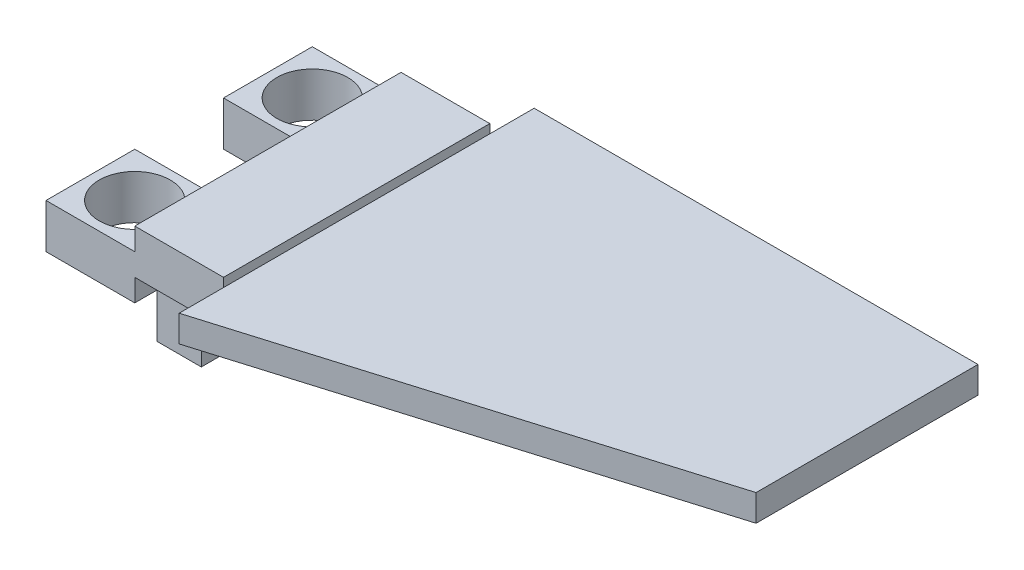
ISO-10303-21;
HEADER;
FILE_DESCRIPTION(('STEP AP214'),'2;1');
FILE_NAME('part.step','',(''),(''),'','','');
FILE_SCHEMA(('AUTOMOTIVE_DESIGN { 1 0 10303 214 1 1 1 1 }'));
ENDSEC;
DATA;
#1=APPLICATION_CONTEXT('core data for automotive mechanical design processes');
#2=APPLICATION_PROTOCOL_DEFINITION('international standard','automotive_design',2000,#1);
#3=PRODUCT_CONTEXT('',#1,'mechanical');
#4=PRODUCT('Part','Part','',(#3));
#5=PRODUCT_RELATED_PRODUCT_CATEGORY('part','',(#4));
#6=PRODUCT_DEFINITION_FORMATION('','',#4);
#7=PRODUCT_DEFINITION_CONTEXT('part definition',#1,'design');
#8=PRODUCT_DEFINITION('design','',#6,#7);
#9=PRODUCT_DEFINITION_SHAPE('','',#8);
#10=(LENGTH_UNIT() NAMED_UNIT(*) SI_UNIT(.MILLI.,.METRE.));
#11=(NAMED_UNIT(*) PLANE_ANGLE_UNIT() SI_UNIT($,.RADIAN.));
#12=(NAMED_UNIT(*) SI_UNIT($,.STERADIAN.) SOLID_ANGLE_UNIT());
#13=UNCERTAINTY_MEASURE_WITH_UNIT(LENGTH_MEASURE(1.E-05),#10,'distance_accuracy_value','');
#14=(GEOMETRIC_REPRESENTATION_CONTEXT(3) GLOBAL_UNCERTAINTY_ASSIGNED_CONTEXT((#13)) GLOBAL_UNIT_ASSIGNED_CONTEXT((#10,
#11,#12)) REPRESENTATION_CONTEXT('',''));
#15=CARTESIAN_POINT('',(0.,0.,0.));
#16=DIRECTION('',(0.,0.,1.));
#17=DIRECTION('',(1.,0.,0.));
#18=AXIS2_PLACEMENT_3D('',#15,#16,#17);
#19=CARTESIAN_POINT('',(9.99999999999999,5.,-15.));
#20=DIRECTION('',(-1.,0.,0.));
#21=DIRECTION('',(0.,0.,1.));
#22=AXIS2_PLACEMENT_3D('',#19,#20,#21);
#23=PLANE('',#22);
#24=DIRECTION('',(0.,0.,1.));
#25=VECTOR('',#24,1.);
#26=CARTESIAN_POINT('',(10.,2.5,-25.));
#27=LINE('',#26,#25);
#28=CARTESIAN_POINT('',(10.,2.5,-25.));
#29=VERTEX_POINT('',#28);
#30=CARTESIAN_POINT('',(9.99999999999999,2.5,-22.5));
#31=VERTEX_POINT('',#30);
#32=EDGE_CURVE('E263',#29,#31,#27,.T.);
#33=ORIENTED_EDGE('',*,*,#32,.T.);
#34=DIRECTION('',(0.,1.,0.));
#35=VECTOR('',#34,1.);
#36=CARTESIAN_POINT('',(9.99999999999999,-5.,-22.5));
#37=LINE('',#36,#35);
#38=CARTESIAN_POINT('',(9.99999999999999,0.,-22.5));
#39=VERTEX_POINT('',#38);
#40=EDGE_CURVE('E351',#39,#31,#37,.T.);
#41=ORIENTED_EDGE('',*,*,#40,.F.);
#42=DIRECTION('',(0.,0.,-1.));
#43=VECTOR('',#42,1.);
#44=CARTESIAN_POINT('',(9.99999999999999,0.,-15.));
#45=LINE('',#44,#43);
#46=CARTESIAN_POINT('',(10.,0.,-25.));
#47=VERTEX_POINT('',#46);
#48=EDGE_CURVE('E440',#39,#47,#45,.T.);
#49=ORIENTED_EDGE('',*,*,#48,.T.);
#50=DIRECTION('',(0.,-1.,0.));
#51=VECTOR('',#50,1.);
#52=CARTESIAN_POINT('',(10.,5.,-25.));
#53=LINE('',#52,#51);
#54=EDGE_CURVE('E58',#29,#47,#53,.T.);
#55=ORIENTED_EDGE('',*,*,#54,.F.);
#56=EDGE_LOOP('',(#33,#41,#49,#55));
#57=FACE_BOUND('',#56,.T.);
#58=ADVANCED_FACE('F35',(#57),#23,.F.);
#59=CARTESIAN_POINT('',(9.99999999999999,2.5,-17.5));
#60=VERTEX_POINT('',#59);
#61=CARTESIAN_POINT('',(9.99999999999999,2.5,-15.));
#62=VERTEX_POINT('',#61);
#63=EDGE_CURVE('E266',#60,#62,#27,.T.);
#64=ORIENTED_EDGE('',*,*,#63,.T.);
#65=DIRECTION('',(0.,-1.,0.));
#66=VECTOR('',#65,1.);
#67=CARTESIAN_POINT('',(9.99999999999999,5.,-15.));
#68=LINE('',#67,#66);
#69=CARTESIAN_POINT('',(9.99999999999999,0.,-15.));
#70=VERTEX_POINT('',#69);
#71=EDGE_CURVE('E448',#62,#70,#68,.T.);
#72=ORIENTED_EDGE('',*,*,#71,.T.);
#73=CARTESIAN_POINT('',(9.99999999999999,0.,-17.5));
#74=VERTEX_POINT('',#73);
#75=EDGE_CURVE('E441',#70,#74,#45,.T.);
#76=ORIENTED_EDGE('',*,*,#75,.T.);
#77=DIRECTION('',(0.,-1.,0.));
#78=VECTOR('',#77,1.);
#79=CARTESIAN_POINT('',(9.99999999999999,-5.,-17.5));
#80=LINE('',#79,#78);
#81=EDGE_CURVE('E365',#60,#74,#80,.T.);
#82=ORIENTED_EDGE('',*,*,#81,.F.);
#83=EDGE_LOOP('',(#64,#72,#76,#82));
#84=FACE_BOUND('',#83,.T.);
#85=ADVANCED_FACE('F591',(#84),#23,.F.);
#86=CARTESIAN_POINT('',(0.,3.5,0.));
#87=DIRECTION('',(0.,-1.,0.));
#88=DIRECTION('',(0.,0.,-1.));
#89=AXIS2_PLACEMENT_3D('',#86,#87,#88);
#90=PLANE('',#89);
#91=DIRECTION('',(0.,0.,-1.));
#92=VECTOR('',#91,1.);
#93=CARTESIAN_POINT('',(19.9999999997544,3.5,291573.5));
#94=LINE('',#93,#92);
#95=CARTESIAN_POINT('',(19.9999999999567,3.5,9.99999999993406));
#96=VERTEX_POINT('',#95);
#97=CARTESIAN_POINT('',(19.9999999999818,3.5,4.99999999999545));
#98=VERTEX_POINT('',#97);
#99=EDGE_CURVE('E400',#96,#98,#94,.T.);
#100=ORIENTED_EDGE('',*,*,#99,.T.);
#101=DIRECTION('',(0.,0.,-1.));
#102=VECTOR('',#101,1.);
#103=CARTESIAN_POINT('',(20.,3.5,0.));
#104=LINE('',#103,#102);
#105=CARTESIAN_POINT('',(19.9999999999818,3.5,-24.9999999999773));
#106=VERTEX_POINT('',#105);
#107=EDGE_CURVE('E349',#98,#106,#104,.T.);
#108=ORIENTED_EDGE('',*,*,#107,.T.);
#109=DIRECTION('',(0.,0.,-1.));
#110=VECTOR('',#109,1.);
#111=CARTESIAN_POINT('',(19.9999999999818,3.5,291573.5));
#112=LINE('',#111,#110);
#113=CARTESIAN_POINT('',(19.9999999999818,3.5,-29.9999999999727));
#114=VERTEX_POINT('',#113);
#115=EDGE_CURVE('E379',#106,#114,#112,.T.);
#116=ORIENTED_EDGE('',*,*,#115,.T.);
#117=DIRECTION('',(1.,0.,0.));
#118=VECTOR('',#117,1.);
#119=CARTESIAN_POINT('',(-399985.,3.5,-29.9999999999727));
#120=LINE('',#119,#118);
#121=CARTESIAN_POINT('',(69.9999999999932,3.5,-29.9999999999727));
#122=VERTEX_POINT('',#121);
#123=EDGE_CURVE('E374',#114,#122,#120,.T.);
#124=ORIENTED_EDGE('',*,*,#123,.T.);
#125=DIRECTION('',(0.,0.,1.));
#126=VECTOR('',#125,1.);
#127=CARTESIAN_POINT('',(69.9999999999932,3.5,291573.5));
#128=LINE('',#127,#126);
#129=CARTESIAN_POINT('',(69.9999999999932,3.5,-5.0000000000523));
#130=VERTEX_POINT('',#129);
#131=EDGE_CURVE('E394',#122,#130,#128,.T.);
#132=ORIENTED_EDGE('',*,*,#131,.T.);
#133=DIRECTION('',(-0.957826285221151,0.,0.287347885566345));
#134=VECTOR('',#133,1.);
#135=CARTESIAN_POINT('',(-447203.899082569,3.5,134177.169724771));
#136=LINE('',#135,#134);
#137=EDGE_CURVE('E397',#130,#96,#136,.T.);
#138=ORIENTED_EDGE('',*,*,#137,.T.);
#139=EDGE_LOOP('',(#100,#108,#116,#124,#132,#138));
#140=FACE_BOUND('',#139,.T.);
#141=ADVANCED_FACE('F516',(#140),#90,.T.);
#142=CARTESIAN_POINT('',(0.,6.5,0.));
#143=DIRECTION('',(0.,-1.,0.));
#144=DIRECTION('',(0.,0.,-1.));
#145=AXIS2_PLACEMENT_3D('',#142,#143,#144);
#146=PLANE('',#145);
#147=DIRECTION('',(0.,0.,-1.));
#148=VECTOR('',#147,1.);
#149=CARTESIAN_POINT('',(20.,6.5,0.));
#150=LINE('',#149,#148);
#151=CARTESIAN_POINT('',(20.,6.5,5.));
#152=VERTEX_POINT('',#151);
#153=CARTESIAN_POINT('',(19.9999999999818,6.5,-24.9999999999773));
#154=VERTEX_POINT('',#153);
#155=EDGE_CURVE('E11',#152,#154,#150,.T.);
#156=ORIENTED_EDGE('',*,*,#155,.F.);
#157=DIRECTION('',(0.,0.,-1.));
#158=VECTOR('',#157,1.);
#159=CARTESIAN_POINT('',(19.9999999997544,6.5,291573.5));
#160=LINE('',#159,#158);
#161=CARTESIAN_POINT('',(19.9999999999567,6.5,9.99999999993406));
#162=VERTEX_POINT('',#161);
#163=EDGE_CURVE('E385',#162,#152,#160,.T.);
#164=ORIENTED_EDGE('',*,*,#163,.F.);
#165=DIRECTION('',(-0.957826285221151,0.,0.287347885566345));
#166=VECTOR('',#165,1.);
#167=CARTESIAN_POINT('',(-447203.899082569,6.5,134177.169724771));
#168=LINE('',#167,#166);
#169=CARTESIAN_POINT('',(69.9999999999932,6.5,-5.0000000000523));
#170=VERTEX_POINT('',#169);
#171=EDGE_CURVE('E382',#170,#162,#168,.T.);
#172=ORIENTED_EDGE('',*,*,#171,.F.);
#173=DIRECTION('',(0.,0.,1.));
#174=VECTOR('',#173,1.);
#175=CARTESIAN_POINT('',(69.9999999999932,6.5,291573.5));
#176=LINE('',#175,#174);
#177=CARTESIAN_POINT('',(69.9999999999932,6.5,-29.9999999999727));
#178=VERTEX_POINT('',#177);
#179=EDGE_CURVE('E378',#178,#170,#176,.T.);
#180=ORIENTED_EDGE('',*,*,#179,.F.);
#181=DIRECTION('',(1.,0.,0.));
#182=VECTOR('',#181,1.);
#183=CARTESIAN_POINT('',(-399985.,6.5,-29.9999999999727));
#184=LINE('',#183,#182);
#185=CARTESIAN_POINT('',(19.9999999999818,6.5,-29.9999999999727));
#186=VERTEX_POINT('',#185);
#187=EDGE_CURVE('E375',#186,#178,#184,.T.);
#188=ORIENTED_EDGE('',*,*,#187,.F.);
#189=DIRECTION('',(0.,0.,-1.));
#190=VECTOR('',#189,1.);
#191=CARTESIAN_POINT('',(19.9999999999818,6.5,291573.5));
#192=LINE('',#191,#190);
#193=EDGE_CURVE('E388',#154,#186,#192,.T.);
#194=ORIENTED_EDGE('',*,*,#193,.F.);
#195=EDGE_LOOP('',(#156,#164,#172,#180,#188,#194));
#196=FACE_BOUND('',#195,.T.);
#197=ADVANCED_FACE('F508',(#196),#146,.F.);
#198=CARTESIAN_POINT('',(15.,-5.,-22.5));
#199=DIRECTION('',(0.,0.,1.));
#200=DIRECTION('',(1.,0.,0.));
#201=AXIS2_PLACEMENT_3D('',#198,#199,#200);
#202=PLANE('',#201);
#203=DIRECTION('',(-1.,0.,0.));
#204=VECTOR('',#203,1.);
#205=CARTESIAN_POINT('',(15.,2.5,-22.5));
#206=LINE('',#205,#204);
#207=CARTESIAN_POINT('',(15.,2.5,-22.5));
#208=VERTEX_POINT('',#207);
#209=EDGE_CURVE('E346',#208,#31,#206,.T.);
#210=ORIENTED_EDGE('',*,*,#209,.F.);
#211=DIRECTION('',(0.,1.,0.));
#212=VECTOR('',#211,1.);
#213=CARTESIAN_POINT('',(15.,-5.,-22.5));
#214=LINE('',#213,#212);
#215=CARTESIAN_POINT('',(15.,-5.,-22.5));
#216=VERTEX_POINT('',#215);
#217=EDGE_CURVE('E352',#216,#208,#214,.T.);
#218=ORIENTED_EDGE('',*,*,#217,.F.);
#219=DIRECTION('',(-1.,0.,0.));
#220=VECTOR('',#219,1.);
#221=CARTESIAN_POINT('',(15.,-5.,-22.5));
#222=LINE('',#221,#220);
#223=CARTESIAN_POINT('',(9.99999999999999,-5.,-22.5));
#224=VERTEX_POINT('',#223);
#225=EDGE_CURVE('E359',#216,#224,#222,.T.);
#226=ORIENTED_EDGE('',*,*,#225,.T.);
#227=EDGE_CURVE('E360',#224,#39,#37,.T.);
#228=ORIENTED_EDGE('',*,*,#227,.T.);
#229=ORIENTED_EDGE('',*,*,#40,.T.);
#230=EDGE_LOOP('',(#210,#218,#226,#228,#229));
#231=FACE_BOUND('',#230,.T.);
#232=ADVANCED_FACE('F474',(#231),#202,.F.);
#233=CARTESIAN_POINT('',(15.,-5.,-17.5));
#234=DIRECTION('',(0.,0.,-1.));
#235=DIRECTION('',(-1.,0.,0.));
#236=AXIS2_PLACEMENT_3D('',#233,#234,#235);
#237=PLANE('',#236);
#238=DIRECTION('',(1.,0.,0.));
#239=VECTOR('',#238,1.);
#240=CARTESIAN_POINT('',(15.,2.5,-17.5));
#241=LINE('',#240,#239);
#242=CARTESIAN_POINT('',(15.,2.5,-17.5));
#243=VERTEX_POINT('',#242);
#244=EDGE_CURVE('E343',#60,#243,#241,.T.);
#245=ORIENTED_EDGE('',*,*,#244,.F.);
#246=ORIENTED_EDGE('',*,*,#81,.T.);
#247=CARTESIAN_POINT('',(9.99999999999999,-5.,-17.5));
#248=VERTEX_POINT('',#247);
#249=EDGE_CURVE('E363',#74,#248,#80,.T.);
#250=ORIENTED_EDGE('',*,*,#249,.T.);
#251=DIRECTION('',(-1.,0.,0.));
#252=VECTOR('',#251,1.);
#253=CARTESIAN_POINT('',(15.,-5.,-17.5));
#254=LINE('',#253,#252);
#255=CARTESIAN_POINT('',(15.,-5.,-17.5));
#256=VERTEX_POINT('',#255);
#257=EDGE_CURVE('E369',#256,#248,#254,.T.);
#258=ORIENTED_EDGE('',*,*,#257,.F.);
#259=DIRECTION('',(0.,-1.,0.));
#260=VECTOR('',#259,1.);
#261=CARTESIAN_POINT('',(15.,-5.,-17.5));
#262=LINE('',#261,#260);
#263=EDGE_CURVE('E354',#243,#256,#262,.T.);
#264=ORIENTED_EDGE('',*,*,#263,.F.);
#265=EDGE_LOOP('',(#245,#246,#250,#258,#264));
#266=FACE_BOUND('',#265,.T.);
#267=ADVANCED_FACE('F464',(#266),#237,.F.);
#268=CARTESIAN_POINT('',(15.,0.,0.));
#269=DIRECTION('',(-1.,0.,0.));
#270=DIRECTION('',(0.,0.,1.));
#271=AXIS2_PLACEMENT_3D('',#268,#269,#270);
#272=PLANE('',#271);
#273=DIRECTION('',(0.,0.,-1.));
#274=VECTOR('',#273,1.);
#275=CARTESIAN_POINT('',(15.,2.5,0.));
#276=LINE('',#275,#274);
#277=EDGE_CURVE('E43',#243,#208,#276,.T.);
#278=ORIENTED_EDGE('',*,*,#277,.F.);
#279=ORIENTED_EDGE('',*,*,#263,.T.);
#280=DIRECTION('',(0.,0.,-1.));
#281=VECTOR('',#280,1.);
#282=CARTESIAN_POINT('',(15.,-5.,-17.5));
#283=LINE('',#282,#281);
#284=EDGE_CURVE('E357',#256,#216,#283,.T.);
#285=ORIENTED_EDGE('',*,*,#284,.T.);
#286=ORIENTED_EDGE('',*,*,#217,.T.);
#287=EDGE_LOOP('',(#278,#279,#285,#286));
#288=FACE_BOUND('',#287,.T.);
#289=ADVANCED_FACE('F460',(#288),#272,.F.);
#290=CARTESIAN_POINT('',(0.,5.,0.));
#291=DIRECTION('',(0.,-1.,0.));
#292=DIRECTION('',(0.,0.,-1.));
#293=AXIS2_PLACEMENT_3D('',#290,#291,#292);
#294=PLANE('',#293);
#295=DIRECTION('',(0.,0.,1.));
#296=VECTOR('',#295,1.);
#297=CARTESIAN_POINT('',(0.,5.,-15.));
#298=LINE('',#297,#296);
#299=CARTESIAN_POINT('',(0.,5.,-25.));
#300=VERTEX_POINT('',#299);
#301=CARTESIAN_POINT('',(0.,5.,-15.));
#302=VERTEX_POINT('',#301);
#303=EDGE_CURVE('E424',#300,#302,#298,.T.);
#304=ORIENTED_EDGE('',*,*,#303,.T.);
#305=DIRECTION('',(1.,0.,0.));
#306=VECTOR('',#305,1.);
#307=CARTESIAN_POINT('',(0.,5.,-15.));
#308=LINE('',#307,#306);
#309=CARTESIAN_POINT('',(9.99999999999999,5.,-15.));
#310=VERTEX_POINT('',#309);
#311=EDGE_CURVE('E427',#302,#310,#308,.T.);
#312=ORIENTED_EDGE('',*,*,#311,.T.);
#313=DIRECTION('',(0.,0.,-1.));
#314=VECTOR('',#313,1.);
#315=CARTESIAN_POINT('',(9.99999999999999,5.,-15.));
#316=LINE('',#315,#314);
#317=CARTESIAN_POINT('',(10.,5.,-25.));
#318=VERTEX_POINT('',#317);
#319=EDGE_CURVE('E430',#310,#318,#316,.T.);
#320=ORIENTED_EDGE('',*,*,#319,.T.);
#321=DIRECTION('',(-1.,0.,0.));
#322=VECTOR('',#321,1.);
#323=CARTESIAN_POINT('',(0.,5.,-25.));
#324=LINE('',#323,#322);
#325=EDGE_CURVE('E432',#318,#300,#324,.T.);
#326=ORIENTED_EDGE('',*,*,#325,.T.);
#327=EDGE_LOOP('',(#304,#312,#320,#326));
#328=FACE_BOUND('',#327,.T.);
#329=CARTESIAN_POINT('',(5.,5.,-20.));
#330=DIRECTION('',(0.,1.,0.));
#331=DIRECTION('',(0.,0.,-1.));
#332=AXIS2_PLACEMENT_3D('',#329,#330,#331);
#333=CIRCLE('',#332,4.);
#334=CARTESIAN_POINT('',(5.,5.,-24.));
#335=VERTEX_POINT('',#334);
#336=EDGE_CURVE('E418',#335,#335,#333,.T.);
#337=ORIENTED_EDGE('',*,*,#336,.F.);
#338=EDGE_LOOP('',(#337));
#339=FACE_BOUND('',#338,.T.);
#340=ADVANCED_FACE('F493',(#328,#339),#294,.F.);
#341=CARTESIAN_POINT('',(0.,0.,0.));
#342=DIRECTION('',(0.,-1.,0.));
#343=DIRECTION('',(0.,0.,-1.));
#344=AXIS2_PLACEMENT_3D('',#341,#342,#343);
#345=PLANE('',#344);
#346=DIRECTION('',(0.,0.,1.));
#347=VECTOR('',#346,1.);
#348=CARTESIAN_POINT('',(0.,0.,-15.));
#349=LINE('',#348,#347);
#350=CARTESIAN_POINT('',(0.,0.,-25.));
#351=VERTEX_POINT('',#350);
#352=CARTESIAN_POINT('',(0.,0.,-15.));
#353=VERTEX_POINT('',#352);
#354=EDGE_CURVE('E421',#351,#353,#349,.T.);
#355=ORIENTED_EDGE('',*,*,#354,.F.);
#356=DIRECTION('',(-1.,0.,0.));
#357=VECTOR('',#356,1.);
#358=CARTESIAN_POINT('',(0.,0.,-25.));
#359=LINE('',#358,#357);
#360=EDGE_CURVE('E428',#47,#351,#359,.T.);
#361=ORIENTED_EDGE('',*,*,#360,.F.);
#362=ORIENTED_EDGE('',*,*,#48,.F.);
#363=DIRECTION('',(0.,0.,-1.));
#364=VECTOR('',#363,1.);
#365=CARTESIAN_POINT('',(10.,0.,0.));
#366=LINE('',#365,#364);
#367=EDGE_CURVE('E372',#74,#39,#366,.T.);
#368=ORIENTED_EDGE('',*,*,#367,.F.);
#369=ORIENTED_EDGE('',*,*,#75,.F.);
#370=DIRECTION('',(1.,0.,0.));
#371=VECTOR('',#370,1.);
#372=CARTESIAN_POINT('',(0.,0.,-15.));
#373=LINE('',#372,#371);
#374=EDGE_CURVE('E437',#353,#70,#373,.T.);
#375=ORIENTED_EDGE('',*,*,#374,.F.);
#376=EDGE_LOOP('',(#355,#361,#362,#368,#369,#375));
#377=FACE_BOUND('',#376,.T.);
#378=CARTESIAN_POINT('',(5.,0.,-20.));
#379=DIRECTION('',(0.,1.,0.));
#380=DIRECTION('',(0.,0.,-1.));
#381=AXIS2_PLACEMENT_3D('',#378,#379,#380);
#382=CIRCLE('',#381,4.);
#383=CARTESIAN_POINT('',(5.,0.,-24.));
#384=VERTEX_POINT('',#383);
#385=EDGE_CURVE('E407',#384,#384,#382,.T.);
#386=ORIENTED_EDGE('',*,*,#385,.T.);
#387=EDGE_LOOP('',(#386));
#388=FACE_BOUND('',#387,.T.);
#389=ADVANCED_FACE('F482',(#377,#388),#345,.T.);
#390=CARTESIAN_POINT('',(0.,5.,-15.));
#391=DIRECTION('',(1.,0.,0.));
#392=DIRECTION('',(0.,0.,-1.));
#393=AXIS2_PLACEMENT_3D('',#390,#391,#392);
#394=PLANE('',#393);
#395=ORIENTED_EDGE('',*,*,#354,.T.);
#396=DIRECTION('',(0.,-1.,0.));
#397=VECTOR('',#396,1.);
#398=CARTESIAN_POINT('',(0.,5.,-15.));
#399=LINE('',#398,#397);
#400=EDGE_CURVE('E450',#302,#353,#399,.T.);
#401=ORIENTED_EDGE('',*,*,#400,.F.);
#402=ORIENTED_EDGE('',*,*,#303,.F.);
#403=DIRECTION('',(0.,-1.,0.));
#404=VECTOR('',#403,1.);
#405=CARTESIAN_POINT('',(0.,5.,-25.));
#406=LINE('',#405,#404);
#407=EDGE_CURVE('E434',#300,#351,#406,.T.);
#408=ORIENTED_EDGE('',*,*,#407,.T.);
#409=EDGE_LOOP('',(#395,#401,#402,#408));
#410=FACE_BOUND('',#409,.T.);
#411=ADVANCED_FACE('F37',(#410),#394,.F.);
#412=CARTESIAN_POINT('',(0.,5.,-15.));
#413=DIRECTION('',(0.,0.,-1.));
#414=DIRECTION('',(-1.,0.,0.));
#415=AXIS2_PLACEMENT_3D('',#412,#413,#414);
#416=PLANE('',#415);
#417=ORIENTED_EDGE('',*,*,#374,.T.);
#418=ORIENTED_EDGE('',*,*,#71,.F.);
#419=EDGE_CURVE('E50',#310,#62,#68,.T.);
#420=ORIENTED_EDGE('',*,*,#419,.F.);
#421=ORIENTED_EDGE('',*,*,#311,.F.);
#422=ORIENTED_EDGE('',*,*,#400,.T.);
#423=EDGE_LOOP('',(#417,#418,#420,#421,#422));
#424=FACE_BOUND('',#423,.T.);
#425=ADVANCED_FACE('F598',(#424),#416,.F.);
#426=CARTESIAN_POINT('',(0.,5.,-25.));
#427=DIRECTION('',(0.,0.,1.));
#428=DIRECTION('',(1.,0.,0.));
#429=AXIS2_PLACEMENT_3D('',#426,#427,#428);
#430=PLANE('',#429);
#431=DIRECTION('',(0.,-1.,0.));
#432=VECTOR('',#431,1.);
#433=CARTESIAN_POINT('',(19.9999999999818,6.5,-24.9999999999773));
#434=LINE('',#433,#432);
#435=EDGE_CURVE('E408',#154,#106,#434,.T.);
#436=ORIENTED_EDGE('',*,*,#435,.T.);
#437=DIRECTION('',(0.,-1.,0.));
#438=VECTOR('',#437,1.);
#439=CARTESIAN_POINT('',(20.,7.5,-25.));
#440=LINE('',#439,#438);
#441=CARTESIAN_POINT('',(20.,2.5,-25.));
#442=VERTEX_POINT('',#441);
#443=EDGE_CURVE('E262',#106,#442,#440,.T.);
#444=ORIENTED_EDGE('',*,*,#443,.T.);
#445=DIRECTION('',(-1.,0.,0.));
#446=VECTOR('',#445,1.);
#447=CARTESIAN_POINT('',(10.,2.5,-25.));
#448=LINE('',#447,#446);
#449=EDGE_CURVE('E255',#442,#29,#448,.T.);
#450=ORIENTED_EDGE('',*,*,#449,.T.);
#451=ORIENTED_EDGE('',*,*,#54,.T.);
#452=ORIENTED_EDGE('',*,*,#360,.T.);
#453=ORIENTED_EDGE('',*,*,#407,.F.);
#454=ORIENTED_EDGE('',*,*,#325,.F.);
#455=DIRECTION('',(0.,-1.,0.));
#456=VECTOR('',#455,1.);
#457=CARTESIAN_POINT('',(9.99999999999091,6.5,-24.9999999999773));
#458=LINE('',#457,#456);
#459=CARTESIAN_POINT('',(10.,7.5,-25.));
#460=VERTEX_POINT('',#459);
#461=EDGE_CURVE('E238',#460,#318,#458,.T.);
#462=ORIENTED_EDGE('',*,*,#461,.F.);
#463=DIRECTION('',(-1.,0.,0.));
#464=VECTOR('',#463,1.);
#465=CARTESIAN_POINT('',(10.,7.5,-25.));
#466=LINE('',#465,#464);
#467=CARTESIAN_POINT('',(20.,7.5,-25.));
#468=VERTEX_POINT('',#467);
#469=EDGE_CURVE('E254',#468,#460,#466,.T.);
#470=ORIENTED_EDGE('',*,*,#469,.F.);
#471=EDGE_CURVE('E273',#468,#154,#440,.T.);
#472=ORIENTED_EDGE('',*,*,#471,.T.);
#473=EDGE_LOOP('',(#436,#444,#450,#451,#452,#453,#454,#462,#470,#472));
#474=FACE_BOUND('',#473,.T.);
#475=ADVANCED_FACE('F487',(#474),#430,.F.);
#476=CARTESIAN_POINT('',(5.,5.,-20.));
#477=DIRECTION('',(0.,-1.,0.));
#478=DIRECTION('',(0.,0.,-1.));
#479=AXIS2_PLACEMENT_3D('',#476,#477,#478);
#480=CYLINDRICAL_SURFACE('',#479,4.);
#481=ORIENTED_EDGE('',*,*,#336,.T.);
#482=EDGE_LOOP('',(#481));
#483=FACE_BOUND('',#482,.T.);
#484=ORIENTED_EDGE('',*,*,#385,.F.);
#485=EDGE_LOOP('',(#484));
#486=FACE_BOUND('',#485,.T.);
#487=ADVANCED_FACE('F605',(#483,#486),#480,.F.);
#488=CARTESIAN_POINT('',(9.99999999999091,6.5,291573.5));
#489=DIRECTION('',(-1.,0.,0.));
#490=DIRECTION('',(0.,0.,1.));
#491=AXIS2_PLACEMENT_3D('',#488,#489,#490);
#492=PLANE('',#491);
#493=DIRECTION('',(0.,0.,-1.));
#494=VECTOR('',#493,1.);
#495=CARTESIAN_POINT('',(10.,5.,-5.));
#496=LINE('',#495,#494);
#497=CARTESIAN_POINT('',(9.99999999999091,5.,4.99999999999545));
#498=VERTEX_POINT('',#497);
#499=CARTESIAN_POINT('',(9.99999999999091,5.,-4.99999999999545));
#500=VERTEX_POINT('',#499);
#501=EDGE_CURVE('E234',#498,#500,#496,.T.);
#502=ORIENTED_EDGE('',*,*,#501,.F.);
#503=DIRECTION('',(0.,-1.,0.));
#504=VECTOR('',#503,1.);
#505=CARTESIAN_POINT('',(9.99999999999091,6.5,4.99999999999545));
#506=LINE('',#505,#504);
#507=CARTESIAN_POINT('',(10.,7.5,5.));
#508=VERTEX_POINT('',#507);
#509=EDGE_CURVE('E227',#508,#498,#506,.T.);
#510=ORIENTED_EDGE('',*,*,#509,.F.);
#511=DIRECTION('',(0.,0.,1.));
#512=VECTOR('',#511,1.);
#513=CARTESIAN_POINT('',(10.,7.5,-25.));
#514=LINE('',#513,#512);
#515=EDGE_CURVE('E232',#460,#508,#514,.T.);
#516=ORIENTED_EDGE('',*,*,#515,.F.);
#517=ORIENTED_EDGE('',*,*,#461,.T.);
#518=ORIENTED_EDGE('',*,*,#319,.F.);
#519=ORIENTED_EDGE('',*,*,#419,.T.);
#520=CARTESIAN_POINT('',(10.,2.5,-5.));
#521=VERTEX_POINT('',#520);
#522=EDGE_CURVE('E267',#62,#521,#27,.T.);
#523=ORIENTED_EDGE('',*,*,#522,.T.);
#524=DIRECTION('',(0.,-1.,0.));
#525=VECTOR('',#524,1.);
#526=CARTESIAN_POINT('',(10.,5.,-5.));
#527=LINE('',#526,#525);
#528=EDGE_CURVE('E338',#500,#521,#527,.T.);
#529=ORIENTED_EDGE('',*,*,#528,.F.);
#530=EDGE_LOOP('',(#502,#510,#516,#517,#518,#519,#523,#529));
#531=FACE_BOUND('',#530,.T.);
#532=ADVANCED_FACE('F229',(#531),#492,.T.);
#533=CARTESIAN_POINT('',(-399985.,6.5,-29.9999999999727));
#534=DIRECTION('',(0.,0.,-1.));
#535=DIRECTION('',(-1.,0.,0.));
#536=AXIS2_PLACEMENT_3D('',#533,#534,#535);
#537=PLANE('',#536);
#538=ORIENTED_EDGE('',*,*,#123,.F.);
#539=DIRECTION('',(0.,-1.,0.));
#540=VECTOR('',#539,1.);
#541=CARTESIAN_POINT('',(19.9999999999818,6.5,-29.9999999999727));
#542=LINE('',#541,#540);
#543=EDGE_CURVE('E405',#186,#114,#542,.T.);
#544=ORIENTED_EDGE('',*,*,#543,.F.);
#545=ORIENTED_EDGE('',*,*,#187,.T.);
#546=DIRECTION('',(0.,-1.,0.));
#547=VECTOR('',#546,1.);
#548=CARTESIAN_POINT('',(69.9999999999932,6.5,-29.9999999999727));
#549=LINE('',#548,#547);
#550=EDGE_CURVE('E391',#178,#122,#549,.T.);
#551=ORIENTED_EDGE('',*,*,#550,.T.);
#552=EDGE_LOOP('',(#538,#544,#545,#551));
#553=FACE_BOUND('',#552,.T.);
#554=ADVANCED_FACE('F513',(#553),#537,.T.);
#555=CARTESIAN_POINT('',(19.9999999999818,6.5,291573.5));
#556=DIRECTION('',(-1.,0.,0.));
#557=DIRECTION('',(0.,0.,1.));
#558=AXIS2_PLACEMENT_3D('',#555,#556,#557);
#559=PLANE('',#558);
#560=ORIENTED_EDGE('',*,*,#115,.F.);
#561=ORIENTED_EDGE('',*,*,#435,.F.);
#562=ORIENTED_EDGE('',*,*,#193,.T.);
#563=ORIENTED_EDGE('',*,*,#543,.T.);
#564=EDGE_LOOP('',(#560,#561,#562,#563));
#565=FACE_BOUND('',#564,.T.);
#566=ADVANCED_FACE('F505',(#565),#559,.T.);
#567=CARTESIAN_POINT('',(-399985.,6.5,4.99999999999545));
#568=DIRECTION('',(0.,0.,1.));
#569=DIRECTION('',(1.,0.,0.));
#570=AXIS2_PLACEMENT_3D('',#567,#568,#569);
#571=PLANE('',#570);
#572=DIRECTION('',(0.,-1.,0.));
#573=VECTOR('',#572,1.);
#574=CARTESIAN_POINT('',(20.,7.5,5.));
#575=LINE('',#574,#573);
#576=CARTESIAN_POINT('',(20.,2.5,5.));
#577=VERTEX_POINT('',#576);
#578=EDGE_CURVE('E275',#98,#577,#575,.T.);
#579=ORIENTED_EDGE('',*,*,#578,.F.);
#580=DIRECTION('',(0.,-1.,0.));
#581=VECTOR('',#580,1.);
#582=CARTESIAN_POINT('',(19.9999999999818,6.5,4.99999999999545));
#583=LINE('',#582,#581);
#584=EDGE_CURVE('E239',#152,#98,#583,.T.);
#585=ORIENTED_EDGE('',*,*,#584,.F.);
#586=CARTESIAN_POINT('',(20.,7.5,5.));
#587=VERTEX_POINT('',#586);
#588=EDGE_CURVE('E246',#587,#152,#575,.T.);
#589=ORIENTED_EDGE('',*,*,#588,.F.);
#590=DIRECTION('',(1.,0.,0.));
#591=VECTOR('',#590,1.);
#592=CARTESIAN_POINT('',(10.,7.5,5.));
#593=LINE('',#592,#591);
#594=EDGE_CURVE('E242',#508,#587,#593,.T.);
#595=ORIENTED_EDGE('',*,*,#594,.F.);
#596=ORIENTED_EDGE('',*,*,#509,.T.);
#597=DIRECTION('',(1.,0.,0.));
#598=VECTOR('',#597,1.);
#599=CARTESIAN_POINT('',(0.,5.,5.));
#600=LINE('',#599,#598);
#601=CARTESIAN_POINT('',(0.,5.,5.));
#602=VERTEX_POINT('',#601);
#603=EDGE_CURVE('E317',#602,#498,#600,.T.);
#604=ORIENTED_EDGE('',*,*,#603,.F.);
#605=DIRECTION('',(0.,-1.,0.));
#606=VECTOR('',#605,1.);
#607=CARTESIAN_POINT('',(0.,5.,5.));
#608=LINE('',#607,#606);
#609=CARTESIAN_POINT('',(0.,0.,5.));
#610=VERTEX_POINT('',#609);
#611=EDGE_CURVE('E331',#602,#610,#608,.T.);
#612=ORIENTED_EDGE('',*,*,#611,.T.);
#613=DIRECTION('',(1.,0.,0.));
#614=VECTOR('',#613,1.);
#615=CARTESIAN_POINT('',(0.,0.,5.));
#616=LINE('',#615,#614);
#617=CARTESIAN_POINT('',(10.,0.,5.));
#618=VERTEX_POINT('',#617);
#619=EDGE_CURVE('E313',#610,#618,#616,.T.);
#620=ORIENTED_EDGE('',*,*,#619,.T.);
#621=DIRECTION('',(0.,-1.,0.));
#622=VECTOR('',#621,1.);
#623=CARTESIAN_POINT('',(10.,5.,5.));
#624=LINE('',#623,#622);
#625=CARTESIAN_POINT('',(10.,2.5,5.));
#626=VERTEX_POINT('',#625);
#627=EDGE_CURVE('E319',#626,#618,#624,.T.);
#628=ORIENTED_EDGE('',*,*,#627,.F.);
#629=DIRECTION('',(1.,0.,0.));
#630=VECTOR('',#629,1.);
#631=CARTESIAN_POINT('',(10.,2.5,5.));
#632=LINE('',#631,#630);
#633=EDGE_CURVE('E265',#626,#577,#632,.T.);
#634=ORIENTED_EDGE('',*,*,#633,.T.);
#635=EDGE_LOOP('',(#579,#585,#589,#595,#596,#604,#612,#620,#628,#634));
#636=FACE_BOUND('',#635,.T.);
#637=ADVANCED_FACE('F244',(#636),#571,.T.);
#638=CARTESIAN_POINT('',(19.9999999997544,6.5,291573.5));
#639=DIRECTION('',(-1.,0.,0.));
#640=DIRECTION('',(0.,0.,1.));
#641=AXIS2_PLACEMENT_3D('',#638,#639,#640);
#642=PLANE('',#641);
#643=ORIENTED_EDGE('',*,*,#99,.F.);
#644=DIRECTION('',(0.,-1.,0.));
#645=VECTOR('',#644,1.);
#646=CARTESIAN_POINT('',(19.9999999999567,6.5,9.99999999993406));
#647=LINE('',#646,#645);
#648=EDGE_CURVE('E413',#162,#96,#647,.T.);
#649=ORIENTED_EDGE('',*,*,#648,.F.);
#650=ORIENTED_EDGE('',*,*,#163,.T.);
#651=ORIENTED_EDGE('',*,*,#584,.T.);
#652=EDGE_LOOP('',(#643,#649,#650,#651));
#653=FACE_BOUND('',#652,.T.);
#654=ADVANCED_FACE('F633',(#653),#642,.T.);
#655=CARTESIAN_POINT('',(-447203.899082569,6.5,134177.169724771));
#656=DIRECTION('',(0.287347885566345,0.,0.957826285221151));
#657=DIRECTION('',(0.957826285221152,0.,-0.287347885566345));
#658=AXIS2_PLACEMENT_3D('',#655,#656,#657);
#659=PLANE('',#658);
#660=ORIENTED_EDGE('',*,*,#137,.F.);
#661=DIRECTION('',(0.,-1.,0.));
#662=VECTOR('',#661,1.);
#663=CARTESIAN_POINT('',(69.9999999999932,6.5,-5.0000000000523));
#664=LINE('',#663,#662);
#665=EDGE_CURVE('E415',#170,#130,#664,.T.);
#666=ORIENTED_EDGE('',*,*,#665,.F.);
#667=ORIENTED_EDGE('',*,*,#171,.T.);
#668=ORIENTED_EDGE('',*,*,#648,.T.);
#669=EDGE_LOOP('',(#660,#666,#667,#668));
#670=FACE_BOUND('',#669,.T.);
#671=ADVANCED_FACE('F636',(#670),#659,.T.);
#672=CARTESIAN_POINT('',(69.9999999999932,6.5,291573.5));
#673=DIRECTION('',(1.,0.,0.));
#674=DIRECTION('',(0.,0.,-1.));
#675=AXIS2_PLACEMENT_3D('',#672,#673,#674);
#676=PLANE('',#675);
#677=ORIENTED_EDGE('',*,*,#131,.F.);
#678=ORIENTED_EDGE('',*,*,#550,.F.);
#679=ORIENTED_EDGE('',*,*,#179,.T.);
#680=ORIENTED_EDGE('',*,*,#665,.T.);
#681=EDGE_LOOP('',(#677,#678,#679,#680));
#682=FACE_BOUND('',#681,.T.);
#683=ADVANCED_FACE('F615',(#682),#676,.T.);
#684=CARTESIAN_POINT('',(15.,-5.,-17.5));
#685=DIRECTION('',(0.,1.,0.));
#686=DIRECTION('',(0.,0.,1.));
#687=AXIS2_PLACEMENT_3D('',#684,#685,#686);
#688=PLANE('',#687);
#689=DIRECTION('',(0.,0.,-1.));
#690=VECTOR('',#689,1.);
#691=CARTESIAN_POINT('',(9.99999999999999,-5.,-17.5));
#692=LINE('',#691,#690);
#693=EDGE_CURVE('E355',#248,#224,#692,.T.);
#694=ORIENTED_EDGE('',*,*,#693,.T.);
#695=ORIENTED_EDGE('',*,*,#225,.F.);
#696=ORIENTED_EDGE('',*,*,#284,.F.);
#697=ORIENTED_EDGE('',*,*,#257,.T.);
#698=EDGE_LOOP('',(#694,#695,#696,#697));
#699=FACE_BOUND('',#698,.T.);
#700=ADVANCED_FACE('F471',(#699),#688,.F.);
#701=CARTESIAN_POINT('',(10.,0.,0.));
#702=DIRECTION('',(-1.,0.,0.));
#703=DIRECTION('',(0.,0.,1.));
#704=AXIS2_PLACEMENT_3D('',#701,#702,#703);
#705=PLANE('',#704);
#706=ORIENTED_EDGE('',*,*,#249,.F.);
#707=ORIENTED_EDGE('',*,*,#367,.T.);
#708=ORIENTED_EDGE('',*,*,#227,.F.);
#709=ORIENTED_EDGE('',*,*,#693,.F.);
#710=EDGE_LOOP('',(#706,#707,#708,#709));
#711=FACE_BOUND('',#710,.T.);
#712=ADVANCED_FACE('F607',(#711),#705,.T.);
#713=CARTESIAN_POINT('',(20.,7.5,-25.));
#714=DIRECTION('',(-1.,0.,0.));
#715=DIRECTION('',(0.,0.,1.));
#716=AXIS2_PLACEMENT_3D('',#713,#714,#715);
#717=PLANE('',#716);
#718=ORIENTED_EDGE('',*,*,#107,.F.);
#719=ORIENTED_EDGE('',*,*,#578,.T.);
#720=DIRECTION('',(0.,0.,-1.));
#721=VECTOR('',#720,1.);
#722=CARTESIAN_POINT('',(20.,2.5,-25.));
#723=LINE('',#722,#721);
#724=EDGE_CURVE('E257',#577,#442,#723,.T.);
#725=ORIENTED_EDGE('',*,*,#724,.T.);
#726=ORIENTED_EDGE('',*,*,#443,.F.);
#727=EDGE_LOOP('',(#718,#719,#725,#726));
#728=FACE_BOUND('',#727,.T.);
#729=ADVANCED_FACE('F520',(#728),#717,.F.);
#730=CARTESIAN_POINT('',(10.,0.,0.));
#731=DIRECTION('',(-1.,0.,0.));
#732=DIRECTION('',(0.,0.,1.));
#733=AXIS2_PLACEMENT_3D('',#730,#731,#732);
#734=PLANE('',#733);
#735=DIRECTION('',(0.,-1.,0.));
#736=VECTOR('',#735,1.);
#737=CARTESIAN_POINT('',(10.,-5.,2.5));
#738=LINE('',#737,#736);
#739=CARTESIAN_POINT('',(10.,0.,2.5));
#740=VERTEX_POINT('',#739);
#741=CARTESIAN_POINT('',(10.,-5.,2.5));
#742=VERTEX_POINT('',#741);
#743=EDGE_CURVE('E294',#740,#742,#738,.T.);
#744=ORIENTED_EDGE('',*,*,#743,.F.);
#745=DIRECTION('',(0.,0.,-1.));
#746=VECTOR('',#745,1.);
#747=CARTESIAN_POINT('',(10.,0.,-5.));
#748=LINE('',#747,#746);
#749=CARTESIAN_POINT('',(10.,0.,-2.5));
#750=VERTEX_POINT('',#749);
#751=EDGE_CURVE('E324',#740,#750,#748,.T.);
#752=ORIENTED_EDGE('',*,*,#751,.T.);
#753=DIRECTION('',(0.,1.,0.));
#754=VECTOR('',#753,1.);
#755=CARTESIAN_POINT('',(10.,-5.,-2.5));
#756=LINE('',#755,#754);
#757=CARTESIAN_POINT('',(10.,-5.,-2.5));
#758=VERTEX_POINT('',#757);
#759=EDGE_CURVE('E283',#758,#750,#756,.T.);
#760=ORIENTED_EDGE('',*,*,#759,.F.);
#761=DIRECTION('',(0.,0.,-1.));
#762=VECTOR('',#761,1.);
#763=CARTESIAN_POINT('',(10.,-5.,2.5));
#764=LINE('',#763,#762);
#765=EDGE_CURVE('E287',#742,#758,#764,.T.);
#766=ORIENTED_EDGE('',*,*,#765,.F.);
#767=EDGE_LOOP('',(#744,#752,#760,#766));
#768=FACE_BOUND('',#767,.T.);
#769=ADVANCED_FACE('F555',(#768),#734,.T.);
#770=CARTESIAN_POINT('',(15.,-5.,2.49999999999999));
#771=DIRECTION('',(0.,1.,0.));
#772=DIRECTION('',(0.,0.,1.));
#773=AXIS2_PLACEMENT_3D('',#770,#771,#772);
#774=PLANE('',#773);
#775=ORIENTED_EDGE('',*,*,#765,.T.);
#776=DIRECTION('',(-1.,0.,0.));
#777=VECTOR('',#776,1.);
#778=CARTESIAN_POINT('',(15.,-5.,-2.5));
#779=LINE('',#778,#777);
#780=CARTESIAN_POINT('',(15.,-5.,-2.5));
#781=VERTEX_POINT('',#780);
#782=EDGE_CURVE('E291',#781,#758,#779,.T.);
#783=ORIENTED_EDGE('',*,*,#782,.F.);
#784=DIRECTION('',(0.,0.,-1.));
#785=VECTOR('',#784,1.);
#786=CARTESIAN_POINT('',(15.,-5.,2.49999999999999));
#787=LINE('',#786,#785);
#788=CARTESIAN_POINT('',(15.,-5.,2.49999999999999));
#789=VERTEX_POINT('',#788);
#790=EDGE_CURVE('E289',#789,#781,#787,.T.);
#791=ORIENTED_EDGE('',*,*,#790,.F.);
#792=DIRECTION('',(-1.,0.,0.));
#793=VECTOR('',#792,1.);
#794=CARTESIAN_POINT('',(15.,-5.,2.49999999999999));
#795=LINE('',#794,#793);
#796=EDGE_CURVE('E301',#789,#742,#795,.T.);
#797=ORIENTED_EDGE('',*,*,#796,.T.);
#798=EDGE_LOOP('',(#775,#783,#791,#797));
#799=FACE_BOUND('',#798,.T.);
#800=ADVANCED_FACE('F563',(#799),#774,.F.);
#801=CARTESIAN_POINT('',(5.,5.,0.));
#802=DIRECTION('',(0.,-1.,0.));
#803=DIRECTION('',(0.,0.,-1.));
#804=AXIS2_PLACEMENT_3D('',#801,#802,#803);
#805=CYLINDRICAL_SURFACE('',#804,4.);
#806=CARTESIAN_POINT('',(5.,5.,0.));
#807=DIRECTION('',(0.,1.,0.));
#808=DIRECTION('',(0.,0.,1.));
#809=AXIS2_PLACEMENT_3D('',#806,#807,#808);
#810=CIRCLE('',#809,4.);
#811=CARTESIAN_POINT('',(5.,5.,4.));
#812=VERTEX_POINT('',#811);
#813=EDGE_CURVE('E305',#812,#812,#810,.T.);
#814=ORIENTED_EDGE('',*,*,#813,.T.);
#815=EDGE_LOOP('',(#814));
#816=FACE_BOUND('',#815,.T.);
#817=CARTESIAN_POINT('',(5.,0.,0.));
#818=DIRECTION('',(0.,1.,0.));
#819=DIRECTION('',(0.,0.,1.));
#820=AXIS2_PLACEMENT_3D('',#817,#818,#819);
#821=CIRCLE('',#820,4.);
#822=CARTESIAN_POINT('',(5.,0.,4.));
#823=VERTEX_POINT('',#822);
#824=EDGE_CURVE('E304',#823,#823,#821,.T.);
#825=ORIENTED_EDGE('',*,*,#824,.F.);
#826=EDGE_LOOP('',(#825));
#827=FACE_BOUND('',#826,.T.);
#828=ADVANCED_FACE('F820',(#816,#827),#805,.F.);
#829=CARTESIAN_POINT('',(0.,5.,-5.));
#830=DIRECTION('',(1.,0.,0.));
#831=DIRECTION('',(0.,0.,-1.));
#832=AXIS2_PLACEMENT_3D('',#829,#830,#831);
#833=PLANE('',#832);
#834=DIRECTION('',(0.,0.,1.));
#835=VECTOR('',#834,1.);
#836=CARTESIAN_POINT('',(0.,0.,-5.));
#837=LINE('',#836,#835);
#838=CARTESIAN_POINT('',(0.,0.,-5.));
#839=VERTEX_POINT('',#838);
#840=EDGE_CURVE('E326',#839,#610,#837,.T.);
#841=ORIENTED_EDGE('',*,*,#840,.T.);
#842=ORIENTED_EDGE('',*,*,#611,.F.);
#843=DIRECTION('',(0.,0.,1.));
#844=VECTOR('',#843,1.);
#845=CARTESIAN_POINT('',(0.,5.,-5.));
#846=LINE('',#845,#844);
#847=CARTESIAN_POINT('',(0.,5.,-5.));
#848=VERTEX_POINT('',#847);
#849=EDGE_CURVE('E315',#848,#602,#846,.T.);
#850=ORIENTED_EDGE('',*,*,#849,.F.);
#851=DIRECTION('',(0.,-1.,0.));
#852=VECTOR('',#851,1.);
#853=CARTESIAN_POINT('',(0.,5.,-5.));
#854=LINE('',#853,#852);
#855=EDGE_CURVE('E334',#848,#839,#854,.T.);
#856=ORIENTED_EDGE('',*,*,#855,.T.);
#857=EDGE_LOOP('',(#841,#842,#850,#856));
#858=FACE_BOUND('',#857,.T.);
#859=ADVANCED_FACE('F572',(#858),#833,.F.);
#860=CARTESIAN_POINT('',(0.,5.,-5.));
#861=DIRECTION('',(0.,0.,1.));
#862=DIRECTION('',(1.,0.,0.));
#863=AXIS2_PLACEMENT_3D('',#860,#861,#862);
#864=PLANE('',#863);
#865=DIRECTION('',(-1.,0.,0.));
#866=VECTOR('',#865,1.);
#867=CARTESIAN_POINT('',(0.,0.,-5.));
#868=LINE('',#867,#866);
#869=CARTESIAN_POINT('',(10.,0.,-5.));
#870=VERTEX_POINT('',#869);
#871=EDGE_CURVE('E323',#870,#839,#868,.T.);
#872=ORIENTED_EDGE('',*,*,#871,.T.);
#873=ORIENTED_EDGE('',*,*,#855,.F.);
#874=DIRECTION('',(-1.,0.,0.));
#875=VECTOR('',#874,1.);
#876=CARTESIAN_POINT('',(0.,5.,-5.));
#877=LINE('',#876,#875);
#878=EDGE_CURVE('E312',#500,#848,#877,.T.);
#879=ORIENTED_EDGE('',*,*,#878,.F.);
#880=ORIENTED_EDGE('',*,*,#528,.T.);
#881=EDGE_CURVE('E337',#521,#870,#527,.T.);
#882=ORIENTED_EDGE('',*,*,#881,.T.);
#883=EDGE_LOOP('',(#872,#873,#879,#880,#882));
#884=FACE_BOUND('',#883,.T.);
#885=ADVANCED_FACE('F575',(#884),#864,.F.);
#886=CARTESIAN_POINT('',(0.,0.,0.));
#887=DIRECTION('',(0.,1.,0.));
#888=DIRECTION('',(0.,0.,1.));
#889=AXIS2_PLACEMENT_3D('',#886,#887,#888);
#890=PLANE('',#889);
#891=EDGE_CURVE('E320',#618,#740,#748,.T.);
#892=ORIENTED_EDGE('',*,*,#891,.F.);
#893=ORIENTED_EDGE('',*,*,#619,.F.);
#894=ORIENTED_EDGE('',*,*,#840,.F.);
#895=ORIENTED_EDGE('',*,*,#871,.F.);
#896=EDGE_CURVE('E308',#750,#870,#748,.T.);
#897=ORIENTED_EDGE('',*,*,#896,.F.);
#898=ORIENTED_EDGE('',*,*,#751,.F.);
#899=EDGE_LOOP('',(#892,#893,#894,#895,#897,#898));
#900=FACE_BOUND('',#899,.T.);
#901=ORIENTED_EDGE('',*,*,#824,.T.);
#902=EDGE_LOOP('',(#901));
#903=FACE_BOUND('',#902,.T.);
#904=ADVANCED_FACE('F550',(#900,#903),#890,.F.);
#905=CARTESIAN_POINT('',(15.,0.,0.));
#906=DIRECTION('',(-1.,0.,0.));
#907=DIRECTION('',(0.,0.,1.));
#908=AXIS2_PLACEMENT_3D('',#905,#906,#907);
#909=PLANE('',#908);
#910=DIRECTION('',(0.,0.,-1.));
#911=VECTOR('',#910,1.);
#912=CARTESIAN_POINT('',(15.,2.5,0.));
#913=LINE('',#912,#911);
#914=CARTESIAN_POINT('',(15.,2.5,2.49999999999999));
#915=VERTEX_POINT('',#914);
#916=CARTESIAN_POINT('',(15.,2.5,-2.5));
#917=VERTEX_POINT('',#916);
#918=EDGE_CURVE('E340',#915,#917,#913,.T.);
#919=ORIENTED_EDGE('',*,*,#918,.F.);
#920=DIRECTION('',(0.,-1.,0.));
#921=VECTOR('',#920,1.);
#922=CARTESIAN_POINT('',(15.,-5.,2.49999999999999));
#923=LINE('',#922,#921);
#924=EDGE_CURVE('E286',#915,#789,#923,.T.);
#925=ORIENTED_EDGE('',*,*,#924,.T.);
#926=ORIENTED_EDGE('',*,*,#790,.T.);
#927=DIRECTION('',(0.,1.,0.));
#928=VECTOR('',#927,1.);
#929=CARTESIAN_POINT('',(15.,-5.,-2.5));
#930=LINE('',#929,#928);
#931=EDGE_CURVE('E284',#781,#917,#930,.T.);
#932=ORIENTED_EDGE('',*,*,#931,.T.);
#933=EDGE_LOOP('',(#919,#925,#926,#932));
#934=FACE_BOUND('',#933,.T.);
#935=ADVANCED_FACE('F566',(#934),#909,.F.);
#936=CARTESIAN_POINT('',(15.,-5.,2.49999999999999));
#937=DIRECTION('',(0.,0.,-1.));
#938=DIRECTION('',(-1.,0.,0.));
#939=AXIS2_PLACEMENT_3D('',#936,#937,#938);
#940=PLANE('',#939);
#941=DIRECTION('',(1.,0.,0.));
#942=VECTOR('',#941,1.);
#943=CARTESIAN_POINT('',(15.,2.5,2.49999999999999));
#944=LINE('',#943,#942);
#945=CARTESIAN_POINT('',(10.,2.5,2.5));
#946=VERTEX_POINT('',#945);
#947=EDGE_CURVE('E277',#946,#915,#944,.T.);
#948=ORIENTED_EDGE('',*,*,#947,.F.);
#949=EDGE_CURVE('E296',#946,#740,#738,.T.);
#950=ORIENTED_EDGE('',*,*,#949,.T.);
#951=ORIENTED_EDGE('',*,*,#743,.T.);
#952=ORIENTED_EDGE('',*,*,#796,.F.);
#953=ORIENTED_EDGE('',*,*,#924,.F.);
#954=EDGE_LOOP('',(#948,#950,#951,#952,#953));
#955=FACE_BOUND('',#954,.T.);
#956=ADVANCED_FACE('F559',(#955),#940,.F.);
#957=CARTESIAN_POINT('',(15.,-5.,-2.5));
#958=DIRECTION('',(0.,0.,1.));
#959=DIRECTION('',(1.,0.,0.));
#960=AXIS2_PLACEMENT_3D('',#957,#958,#959);
#961=PLANE('',#960);
#962=DIRECTION('',(-1.,0.,0.));
#963=VECTOR('',#962,1.);
#964=CARTESIAN_POINT('',(15.,2.5,-2.5));
#965=LINE('',#964,#963);
#966=CARTESIAN_POINT('',(10.,2.5,-2.5));
#967=VERTEX_POINT('',#966);
#968=EDGE_CURVE('E280',#917,#967,#965,.T.);
#969=ORIENTED_EDGE('',*,*,#968,.F.);
#970=ORIENTED_EDGE('',*,*,#931,.F.);
#971=ORIENTED_EDGE('',*,*,#782,.T.);
#972=ORIENTED_EDGE('',*,*,#759,.T.);
#973=EDGE_CURVE('E295',#750,#967,#756,.T.);
#974=ORIENTED_EDGE('',*,*,#973,.T.);
#975=EDGE_LOOP('',(#969,#970,#971,#972,#974));
#976=FACE_BOUND('',#975,.T.);
#977=ADVANCED_FACE('F544',(#976),#961,.F.);
#978=CARTESIAN_POINT('',(0.,5.,0.));
#979=DIRECTION('',(0.,1.,0.));
#980=DIRECTION('',(0.,0.,1.));
#981=AXIS2_PLACEMENT_3D('',#978,#979,#980);
#982=PLANE('',#981);
#983=ORIENTED_EDGE('',*,*,#813,.F.);
#984=EDGE_LOOP('',(#983));
#985=FACE_BOUND('',#984,.T.);
#986=ORIENTED_EDGE('',*,*,#501,.T.);
#987=ORIENTED_EDGE('',*,*,#878,.T.);
#988=ORIENTED_EDGE('',*,*,#849,.T.);
#989=ORIENTED_EDGE('',*,*,#603,.T.);
#990=EDGE_LOOP('',(#986,#987,#988,#989));
#991=FACE_BOUND('',#990,.T.);
#992=ADVANCED_FACE('F577',(#985,#991),#982,.T.);
#993=CARTESIAN_POINT('',(10.,5.,-5.));
#994=DIRECTION('',(-1.,0.,0.));
#995=DIRECTION('',(0.,0.,1.));
#996=AXIS2_PLACEMENT_3D('',#993,#994,#995);
#997=PLANE('',#996);
#998=EDGE_CURVE('E526',#946,#626,#27,.T.);
#999=ORIENTED_EDGE('',*,*,#998,.T.);
#1000=ORIENTED_EDGE('',*,*,#627,.T.);
#1001=ORIENTED_EDGE('',*,*,#891,.T.);
#1002=ORIENTED_EDGE('',*,*,#949,.F.);
#1003=EDGE_LOOP('',(#999,#1000,#1001,#1002));
#1004=FACE_BOUND('',#1003,.T.);
#1005=ADVANCED_FACE('F567',(#1004),#997,.F.);
#1006=EDGE_CURVE('E268',#521,#967,#27,.T.);
#1007=ORIENTED_EDGE('',*,*,#1006,.T.);
#1008=ORIENTED_EDGE('',*,*,#973,.F.);
#1009=ORIENTED_EDGE('',*,*,#896,.T.);
#1010=ORIENTED_EDGE('',*,*,#881,.F.);
#1011=EDGE_LOOP('',(#1007,#1008,#1009,#1010));
#1012=FACE_BOUND('',#1011,.T.);
#1013=ADVANCED_FACE('F536',(#1012),#997,.F.);
#1014=CARTESIAN_POINT('',(0.,2.5,0.));
#1015=DIRECTION('',(0.,1.,0.));
#1016=DIRECTION('',(0.,0.,1.));
#1017=AXIS2_PLACEMENT_3D('',#1014,#1015,#1016);
#1018=PLANE('',#1017);
#1019=ORIENTED_EDGE('',*,*,#277,.T.);
#1020=ORIENTED_EDGE('',*,*,#209,.T.);
#1021=ORIENTED_EDGE('',*,*,#32,.F.);
#1022=ORIENTED_EDGE('',*,*,#449,.F.);
#1023=ORIENTED_EDGE('',*,*,#724,.F.);
#1024=ORIENTED_EDGE('',*,*,#633,.F.);
#1025=ORIENTED_EDGE('',*,*,#998,.F.);
#1026=ORIENTED_EDGE('',*,*,#947,.T.);
#1027=ORIENTED_EDGE('',*,*,#918,.T.);
#1028=ORIENTED_EDGE('',*,*,#968,.T.);
#1029=ORIENTED_EDGE('',*,*,#1006,.F.);
#1030=ORIENTED_EDGE('',*,*,#522,.F.);
#1031=ORIENTED_EDGE('',*,*,#63,.F.);
#1032=ORIENTED_EDGE('',*,*,#244,.T.);
#1033=EDGE_LOOP('',(#1019,#1020,#1021,#1022,#1023,#1024,#1025,#1026,#1027,#1028,#1029,#1030,
#1031,#1032));
#1034=FACE_BOUND('',#1033,.T.);
#1035=ADVANCED_FACE('F454',(#1034),#1018,.F.);
#1036=ORIENTED_EDGE('',*,*,#588,.T.);
#1037=ORIENTED_EDGE('',*,*,#155,.T.);
#1038=ORIENTED_EDGE('',*,*,#471,.F.);
#1039=DIRECTION('',(0.,0.,-1.));
#1040=VECTOR('',#1039,1.);
#1041=CARTESIAN_POINT('',(20.,7.5,-25.));
#1042=LINE('',#1041,#1040);
#1043=EDGE_CURVE('E249',#587,#468,#1042,.T.);
#1044=ORIENTED_EDGE('',*,*,#1043,.F.);
#1045=EDGE_LOOP('',(#1036,#1037,#1038,#1044));
#1046=FACE_BOUND('',#1045,.T.);
#1047=ADVANCED_FACE('F500',(#1046),#717,.F.);
#1048=CARTESIAN_POINT('',(0.,7.5,0.));
#1049=DIRECTION('',(0.,1.,0.));
#1050=DIRECTION('',(0.,0.,1.));
#1051=AXIS2_PLACEMENT_3D('',#1048,#1049,#1050);
#1052=PLANE('',#1051);
#1053=ORIENTED_EDGE('',*,*,#515,.T.);
#1054=ORIENTED_EDGE('',*,*,#594,.T.);
#1055=ORIENTED_EDGE('',*,*,#1043,.T.);
#1056=ORIENTED_EDGE('',*,*,#469,.T.);
#1057=EDGE_LOOP('',(#1053,#1054,#1055,#1056));
#1058=FACE_BOUND('',#1057,.T.);
#1059=ADVANCED_FACE('F252',(#1058),#1052,.T.);
#1060=CLOSED_SHELL('',(#58,#85,#141,#197,#232,#267,#289,#340,#389,#411,#425,#475,#487,#532,#554,
#566,#637,#654,#671,#683,#700,#712,#729,#769,#800,#828,#859,#885,#904,#935,#956,#977,#992,#1005,
#1013,#1035,#1047,#1059));
#1061=MANIFOLD_SOLID_BREP('B2',#1060);
#1062=ADVANCED_BREP_SHAPE_REPRESENTATION('',(#18,#1061),#14);
#1063=SHAPE_DEFINITION_REPRESENTATION(#9,#1062);
ENDSEC;
END-ISO-10303-21;
